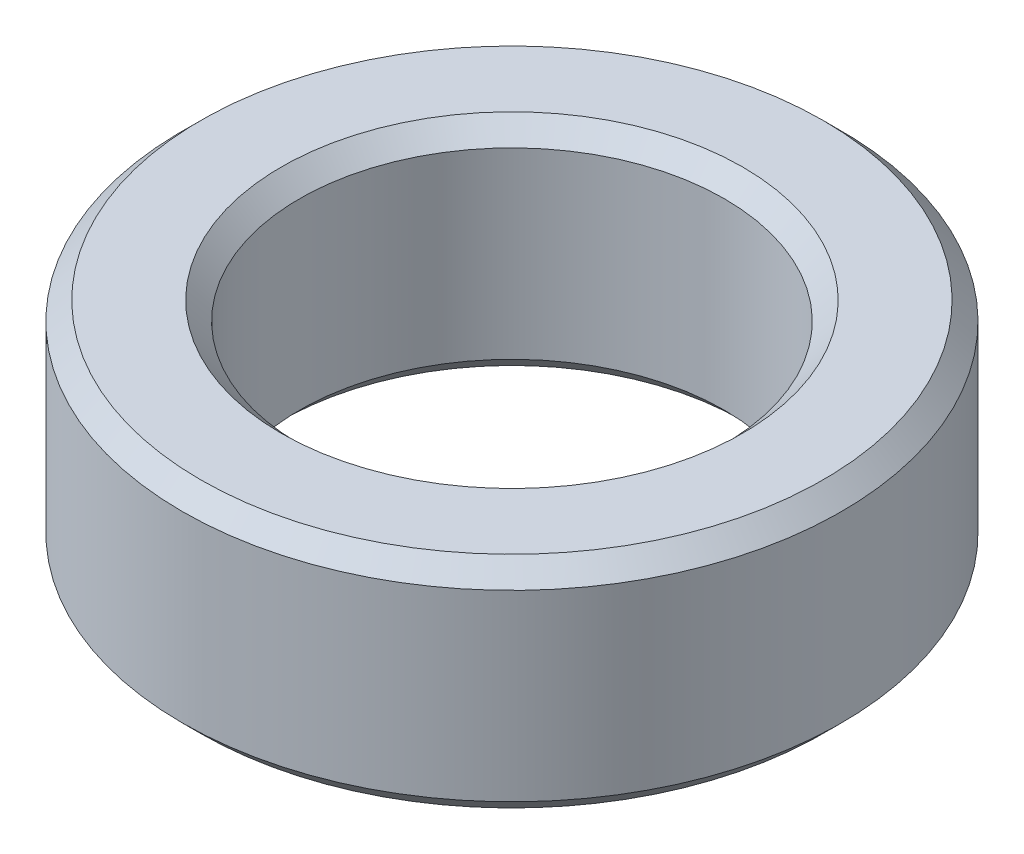
ISO-10303-21;
HEADER;
FILE_DESCRIPTION(('STEP AP214'),'2;1');
FILE_NAME('part.step','',(''),(''),'','','');
FILE_SCHEMA(('AUTOMOTIVE_DESIGN { 1 0 10303 214 1 1 1 1 }'));
ENDSEC;
DATA;
#1=APPLICATION_CONTEXT('core data for automotive mechanical design processes');
#2=APPLICATION_PROTOCOL_DEFINITION('international standard','automotive_design',2000,#1);
#3=PRODUCT_CONTEXT('',#1,'mechanical');
#4=PRODUCT('Part','Part','',(#3));
#5=PRODUCT_RELATED_PRODUCT_CATEGORY('part','',(#4));
#6=PRODUCT_DEFINITION_FORMATION('','',#4);
#7=PRODUCT_DEFINITION_CONTEXT('part definition',#1,'design');
#8=PRODUCT_DEFINITION('design','',#6,#7);
#9=PRODUCT_DEFINITION_SHAPE('','',#8);
#10=(LENGTH_UNIT() NAMED_UNIT(*) SI_UNIT(.MILLI.,.METRE.));
#11=(NAMED_UNIT(*) PLANE_ANGLE_UNIT() SI_UNIT($,.RADIAN.));
#12=(NAMED_UNIT(*) SI_UNIT($,.STERADIAN.) SOLID_ANGLE_UNIT());
#13=UNCERTAINTY_MEASURE_WITH_UNIT(LENGTH_MEASURE(1.E-05),#10,'distance_accuracy_value','');
#14=(GEOMETRIC_REPRESENTATION_CONTEXT(3) GLOBAL_UNCERTAINTY_ASSIGNED_CONTEXT((#13)) GLOBAL_UNIT_ASSIGNED_CONTEXT((#10,
#11,#12)) REPRESENTATION_CONTEXT('',''));
#15=CARTESIAN_POINT('',(0.,0.,0.));
#16=DIRECTION('',(0.,0.,1.));
#17=DIRECTION('',(1.,0.,0.));
#18=AXIS2_PLACEMENT_3D('',#15,#16,#17);
#19=CARTESIAN_POINT('',(0.,3.,0.));
#20=DIRECTION('',(0.,1.,0.));
#21=DIRECTION('',(0.,0.,1.));
#22=AXIS2_PLACEMENT_3D('',#19,#20,#21);
#23=PLANE('',#22);
#24=CARTESIAN_POINT('',(0.,3.,0.));
#25=DIRECTION('',(0.,1.,0.));
#26=DIRECTION('',(0.,0.,1.));
#27=AXIS2_PLACEMENT_3D('',#24,#25,#26);
#28=CIRCLE('',#27,4.25);
#29=CARTESIAN_POINT('',(0.,3.,4.25));
#30=VERTEX_POINT('',#29);
#31=EDGE_CURVE('E72',#30,#30,#28,.T.);
#32=ORIENTED_EDGE('',*,*,#31,.T.);
#33=EDGE_LOOP('',(#32));
#34=FACE_BOUND('',#33,.T.);
#35=CARTESIAN_POINT('',(0.,3.,0.));
#36=DIRECTION('',(0.,1.,0.));
#37=DIRECTION('',(0.,0.,1.));
#38=AXIS2_PLACEMENT_3D('',#35,#36,#37);
#39=CIRCLE('',#38,3.15);
#40=CARTESIAN_POINT('',(0.,3.,3.15));
#41=VERTEX_POINT('',#40);
#42=EDGE_CURVE('E76',#41,#41,#39,.F.);
#43=ORIENTED_EDGE('',*,*,#42,.T.);
#44=EDGE_LOOP('',(#43));
#45=FACE_BOUND('',#44,.T.);
#46=ADVANCED_FACE('F39',(#34,#45),#23,.T.);
#47=CARTESIAN_POINT('',(0.,0.,0.));
#48=DIRECTION('',(0.,1.,0.));
#49=DIRECTION('',(0.,0.,1.));
#50=AXIS2_PLACEMENT_3D('',#47,#48,#49);
#51=PLANE('',#50);
#52=CARTESIAN_POINT('',(0.,0.,0.));
#53=DIRECTION('',(0.,1.,0.));
#54=DIRECTION('',(0.,0.,1.));
#55=AXIS2_PLACEMENT_3D('',#52,#53,#54);
#56=CIRCLE('',#55,4.25);
#57=CARTESIAN_POINT('',(0.,0.,4.25));
#58=VERTEX_POINT('',#57);
#59=EDGE_CURVE('E53',#58,#58,#56,.F.);
#60=ORIENTED_EDGE('',*,*,#59,.T.);
#61=EDGE_LOOP('',(#60));
#62=FACE_BOUND('',#61,.T.);
#63=CARTESIAN_POINT('',(0.,0.,0.));
#64=DIRECTION('',(0.,1.,0.));
#65=DIRECTION('',(0.,0.,1.));
#66=AXIS2_PLACEMENT_3D('',#63,#64,#65);
#67=CIRCLE('',#66,3.15);
#68=CARTESIAN_POINT('',(0.,0.,3.15));
#69=VERTEX_POINT('',#68);
#70=EDGE_CURVE('E58',#69,#69,#67,.T.);
#71=ORIENTED_EDGE('',*,*,#70,.T.);
#72=EDGE_LOOP('',(#71));
#73=FACE_BOUND('',#72,.T.);
#74=ADVANCED_FACE('F91',(#62,#73),#51,.F.);
#75=CARTESIAN_POINT('',(0.,3.,0.));
#76=DIRECTION('',(0.,-1.,0.));
#77=DIRECTION('',(0.,0.,-1.));
#78=AXIS2_PLACEMENT_3D('',#75,#76,#77);
#79=CYLINDRICAL_SURFACE('',#78,4.5);
#80=CARTESIAN_POINT('',(0.,2.75,0.));
#81=DIRECTION('',(0.,1.,0.));
#82=DIRECTION('',(0.,0.,1.));
#83=AXIS2_PLACEMENT_3D('',#80,#81,#82);
#84=CIRCLE('',#83,4.5);
#85=CARTESIAN_POINT('',(0.,2.75,4.5));
#86=VERTEX_POINT('',#85);
#87=EDGE_CURVE('E64',#86,#86,#84,.F.);
#88=ORIENTED_EDGE('',*,*,#87,.T.);
#89=EDGE_LOOP('',(#88));
#90=FACE_BOUND('',#89,.T.);
#91=CARTESIAN_POINT('',(0.,0.250000000000002,0.));
#92=DIRECTION('',(0.,1.,0.));
#93=DIRECTION('',(0.,0.,1.));
#94=AXIS2_PLACEMENT_3D('',#91,#92,#93);
#95=CIRCLE('',#94,4.5);
#96=CARTESIAN_POINT('',(0.,0.250000000000002,4.5));
#97=VERTEX_POINT('',#96);
#98=EDGE_CURVE('E68',#97,#97,#95,.T.);
#99=ORIENTED_EDGE('',*,*,#98,.T.);
#100=EDGE_LOOP('',(#99));
#101=FACE_BOUND('',#100,.T.);
#102=ADVANCED_FACE('F97',(#90,#101),#79,.T.);
#103=CARTESIAN_POINT('',(0.,3.,0.));
#104=DIRECTION('',(0.,-1.,0.));
#105=DIRECTION('',(0.,0.,-1.));
#106=AXIS2_PLACEMENT_3D('',#103,#104,#105);
#107=CYLINDRICAL_SURFACE('',#106,2.9);
#108=CARTESIAN_POINT('',(0.,0.250000000000002,0.));
#109=DIRECTION('',(0.,1.,0.));
#110=DIRECTION('',(0.,0.,1.));
#111=AXIS2_PLACEMENT_3D('',#108,#109,#110);
#112=CIRCLE('',#111,2.9);
#113=CARTESIAN_POINT('',(0.,0.250000000000002,2.9));
#114=VERTEX_POINT('',#113);
#115=EDGE_CURVE('E10',#114,#114,#112,.F.);
#116=ORIENTED_EDGE('',*,*,#115,.T.);
#117=EDGE_LOOP('',(#116));
#118=FACE_BOUND('',#117,.T.);
#119=CARTESIAN_POINT('',(0.,2.75,0.));
#120=DIRECTION('',(0.,1.,0.));
#121=DIRECTION('',(0.,0.,1.));
#122=AXIS2_PLACEMENT_3D('',#119,#120,#121);
#123=CIRCLE('',#122,2.9);
#124=CARTESIAN_POINT('',(0.,2.75,2.9));
#125=VERTEX_POINT('',#124);
#126=EDGE_CURVE('E48',#125,#125,#123,.T.);
#127=ORIENTED_EDGE('',*,*,#126,.T.);
#128=EDGE_LOOP('',(#127));
#129=FACE_BOUND('',#128,.T.);
#130=ADVANCED_FACE('F101',(#118,#129),#107,.F.);
#131=CARTESIAN_POINT('',(0.,3.,0.));
#132=DIRECTION('',(0.,-1.,0.));
#133=DIRECTION('',(0.,0.,-1.));
#134=AXIS2_PLACEMENT_3D('',#131,#132,#133);
#135=CONICAL_SURFACE('',#134,4.25,0.785398163397445);
#136=ORIENTED_EDGE('',*,*,#87,.F.);
#137=EDGE_LOOP('',(#136));
#138=FACE_BOUND('',#137,.T.);
#139=ORIENTED_EDGE('',*,*,#31,.F.);
#140=EDGE_LOOP('',(#139));
#141=FACE_BOUND('',#140,.T.);
#142=ADVANCED_FACE('F107',(#138,#141),#135,.T.);
#143=CARTESIAN_POINT('',(0.,0.250000000000002,0.));
#144=DIRECTION('',(0.,1.,0.));
#145=DIRECTION('',(0.,0.,1.));
#146=AXIS2_PLACEMENT_3D('',#143,#144,#145);
#147=CONICAL_SURFACE('',#146,4.5,0.785398163397452);
#148=ORIENTED_EDGE('',*,*,#59,.F.);
#149=EDGE_LOOP('',(#148));
#150=FACE_BOUND('',#149,.T.);
#151=ORIENTED_EDGE('',*,*,#98,.F.);
#152=EDGE_LOOP('',(#151));
#153=FACE_BOUND('',#152,.T.);
#154=ADVANCED_FACE('F88',(#150,#153),#147,.T.);
#155=CARTESIAN_POINT('',(0.,0.,0.));
#156=DIRECTION('',(0.,-1.,0.));
#157=DIRECTION('',(0.,0.,-1.));
#158=AXIS2_PLACEMENT_3D('',#155,#156,#157);
#159=CONICAL_SURFACE('',#158,3.15,0.785398163397447);
#160=ORIENTED_EDGE('',*,*,#115,.F.);
#161=EDGE_LOOP('',(#160));
#162=FACE_BOUND('',#161,.T.);
#163=ORIENTED_EDGE('',*,*,#70,.F.);
#164=EDGE_LOOP('',(#163));
#165=FACE_BOUND('',#164,.T.);
#166=ADVANCED_FACE('F84',(#162,#165),#159,.F.);
#167=CARTESIAN_POINT('',(0.,2.75,0.));
#168=DIRECTION('',(0.,1.,0.));
#169=DIRECTION('',(0.,0.,1.));
#170=AXIS2_PLACEMENT_3D('',#167,#168,#169);
#171=CONICAL_SURFACE('',#170,2.9,0.785398163397449);
#172=ORIENTED_EDGE('',*,*,#42,.F.);
#173=EDGE_LOOP('',(#172));
#174=FACE_BOUND('',#173,.T.);
#175=ORIENTED_EDGE('',*,*,#126,.F.);
#176=EDGE_LOOP('',(#175));
#177=FACE_BOUND('',#176,.T.);
#178=ADVANCED_FACE('F42',(#174,#177),#171,.F.);
#179=CLOSED_SHELL('',(#46,#74,#102,#130,#142,#154,#166,#178));
#180=MANIFOLD_SOLID_BREP('B2',#179);
#181=ADVANCED_BREP_SHAPE_REPRESENTATION('',(#18,#180),#14);
#182=SHAPE_DEFINITION_REPRESENTATION(#9,#181);
ENDSEC;
END-ISO-10303-21;
